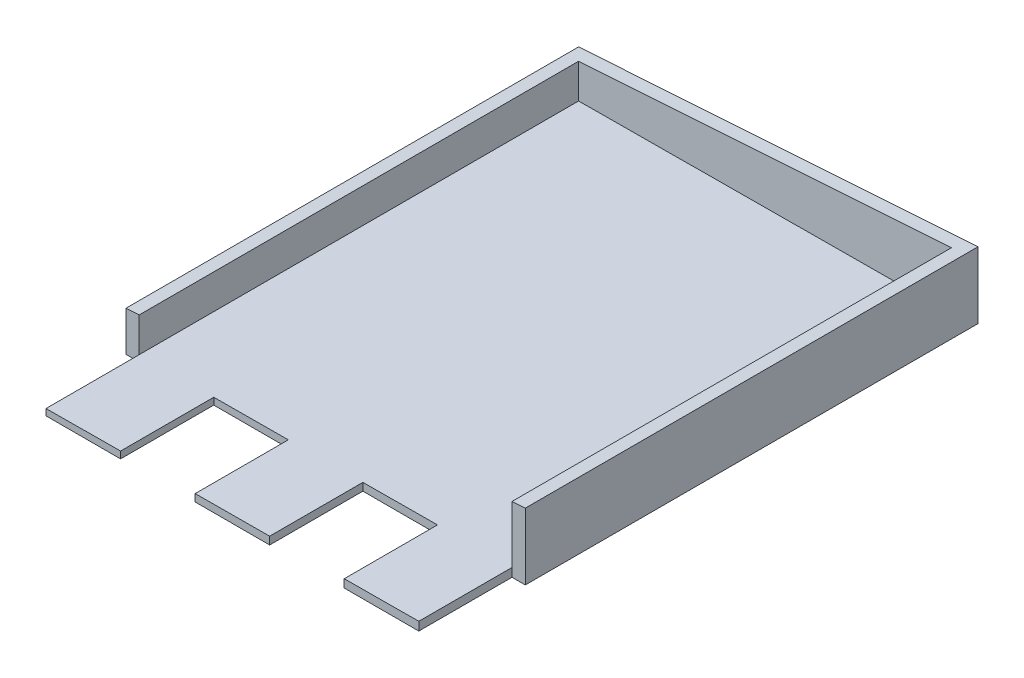
ISO-10303-21;
HEADER;
FILE_DESCRIPTION(('STEP AP214'),'2;1');
FILE_NAME('part.step','',(''),(''),'','','');
FILE_SCHEMA(('AUTOMOTIVE_DESIGN { 1 0 10303 214 1 1 1 1 }'));
ENDSEC;
DATA;
#1=APPLICATION_CONTEXT('core data for automotive mechanical design processes');
#2=APPLICATION_PROTOCOL_DEFINITION('international standard','automotive_design',2000,#1);
#3=PRODUCT_CONTEXT('',#1,'mechanical');
#4=PRODUCT('Part','Part','',(#3));
#5=PRODUCT_RELATED_PRODUCT_CATEGORY('part','',(#4));
#6=PRODUCT_DEFINITION_FORMATION('','',#4);
#7=PRODUCT_DEFINITION_CONTEXT('part definition',#1,'design');
#8=PRODUCT_DEFINITION('design','',#6,#7);
#9=PRODUCT_DEFINITION_SHAPE('','',#8);
#10=(LENGTH_UNIT() NAMED_UNIT(*) SI_UNIT(.MILLI.,.METRE.));
#11=(NAMED_UNIT(*) PLANE_ANGLE_UNIT() SI_UNIT($,.RADIAN.));
#12=(NAMED_UNIT(*) SI_UNIT($,.STERADIAN.) SOLID_ANGLE_UNIT());
#13=UNCERTAINTY_MEASURE_WITH_UNIT(LENGTH_MEASURE(1.E-05),#10,'distance_accuracy_value','');
#14=(GEOMETRIC_REPRESENTATION_CONTEXT(3) GLOBAL_UNCERTAINTY_ASSIGNED_CONTEXT((#13)) GLOBAL_UNIT_ASSIGNED_CONTEXT((#10,
#11,#12)) REPRESENTATION_CONTEXT('',''));
#15=CARTESIAN_POINT('',(0.,0.,0.));
#16=DIRECTION('',(0.,0.,1.));
#17=DIRECTION('',(1.,0.,0.));
#18=AXIS2_PLACEMENT_3D('',#15,#16,#17);
#19=CARTESIAN_POINT('',(0.,0.,170.));
#20=DIRECTION('',(0.,0.,1.));
#21=DIRECTION('',(1.,0.,0.));
#22=AXIS2_PLACEMENT_3D('',#19,#20,#21);
#23=PLANE('',#22);
#24=DIRECTION('',(1.,0.,0.));
#25=VECTOR('',#24,1.);
#26=CARTESIAN_POINT('',(1.57459931571508E-13,-15.,170.));
#27=LINE('',#26,#25);
#28=CARTESIAN_POINT('',(1.57459931571508E-13,-15.,170.));
#29=VERTEX_POINT('',#28);
#30=CARTESIAN_POINT('',(5.,-15.,170.));
#31=VERTEX_POINT('',#30);
#32=EDGE_CURVE('E204',#29,#31,#27,.T.);
#33=ORIENTED_EDGE('',*,*,#32,.T.);
#34=DIRECTION('',(0.,-1.,0.));
#35=VECTOR('',#34,1.);
#36=CARTESIAN_POINT('',(5.,-12.6,170.));
#37=LINE('',#36,#35);
#38=CARTESIAN_POINT('',(5.,-12.6,170.));
#39=VERTEX_POINT('',#38);
#40=EDGE_CURVE('E195',#39,#31,#37,.T.);
#41=ORIENTED_EDGE('',*,*,#40,.F.);
#42=DIRECTION('',(0.,-1.,0.));
#43=VECTOR('',#42,1.);
#44=CARTESIAN_POINT('',(5.,0.333333333333333,170.));
#45=LINE('',#44,#43);
#46=CARTESIAN_POINT('',(5.,0.333333333333333,170.));
#47=VERTEX_POINT('',#46);
#48=EDGE_CURVE('E290',#47,#39,#45,.T.);
#49=ORIENTED_EDGE('',*,*,#48,.F.);
#50=DIRECTION('',(-0.997785157856609,-0.0665190105237739,0.));
#51=VECTOR('',#50,1.);
#52=CARTESIAN_POINT('',(0.,0.,170.));
#53=LINE('',#52,#51);
#54=CARTESIAN_POINT('',(0.,0.,170.));
#55=VERTEX_POINT('',#54);
#56=EDGE_CURVE('E233',#47,#55,#53,.T.);
#57=ORIENTED_EDGE('',*,*,#56,.T.);
#58=DIRECTION('',(0.,-1.,0.));
#59=VECTOR('',#58,1.);
#60=CARTESIAN_POINT('',(0.,0.,170.));
#61=LINE('',#60,#59);
#62=EDGE_CURVE('E214',#55,#29,#61,.T.);
#63=ORIENTED_EDGE('',*,*,#62,.T.);
#64=EDGE_LOOP('',(#33,#41,#49,#57,#63));
#65=FACE_BOUND('',#64,.T.);
#66=ADVANCED_FACE('F43',(#65),#23,.T.);
#67=DIRECTION('',(0.99998367386921,0.00571419242210977,0.));
#68=VECTOR('',#67,1.);
#69=CARTESIAN_POINT('',(5.,-12.6,170.));
#70=LINE('',#69,#68);
#71=CARTESIAN_POINT('',(33.,-12.44,170.));
#72=VERTEX_POINT('',#71);
#73=CARTESIAN_POINT('',(61.,-12.28,170.));
#74=VERTEX_POINT('',#73);
#75=EDGE_CURVE('E193',#72,#74,#70,.T.);
#76=ORIENTED_EDGE('',*,*,#75,.F.);
#77=DIRECTION('',(0.,1.,0.));
#78=VECTOR('',#77,1.);
#79=CARTESIAN_POINT('',(33.,-15.,170.));
#80=LINE('',#79,#78);
#81=CARTESIAN_POINT('',(33.,-15.,170.));
#82=VERTEX_POINT('',#81);
#83=EDGE_CURVE('E179',#82,#72,#80,.T.);
#84=ORIENTED_EDGE('',*,*,#83,.F.);
#85=CARTESIAN_POINT('',(61.,-15.,170.));
#86=VERTEX_POINT('',#85);
#87=EDGE_CURVE('E191',#82,#86,#27,.T.);
#88=ORIENTED_EDGE('',*,*,#87,.T.);
#89=DIRECTION('',(0.,-1.,0.));
#90=VECTOR('',#89,1.);
#91=CARTESIAN_POINT('',(61.,-15.,170.));
#92=LINE('',#91,#90);
#93=EDGE_CURVE('E361',#74,#86,#92,.T.);
#94=ORIENTED_EDGE('',*,*,#93,.F.);
#95=EDGE_LOOP('',(#76,#84,#88,#94));
#96=FACE_BOUND('',#95,.T.);
#97=ADVANCED_FACE('F189',(#96),#23,.T.);
#98=CARTESIAN_POINT('',(89.,-12.12,170.));
#99=VERTEX_POINT('',#98);
#100=CARTESIAN_POINT('',(117.,-11.96,170.));
#101=VERTEX_POINT('',#100);
#102=EDGE_CURVE('E289',#99,#101,#70,.T.);
#103=ORIENTED_EDGE('',*,*,#102,.F.);
#104=DIRECTION('',(0.,1.,0.));
#105=VECTOR('',#104,1.);
#106=CARTESIAN_POINT('',(89.,-12.12,170.));
#107=LINE('',#106,#105);
#108=CARTESIAN_POINT('',(89.,-15.,170.));
#109=VERTEX_POINT('',#108);
#110=EDGE_CURVE('E357',#109,#99,#107,.T.);
#111=ORIENTED_EDGE('',*,*,#110,.F.);
#112=CARTESIAN_POINT('',(117.,-15.,170.));
#113=VERTEX_POINT('',#112);
#114=EDGE_CURVE('E205',#109,#113,#27,.T.);
#115=ORIENTED_EDGE('',*,*,#114,.T.);
#116=DIRECTION('',(0.,-1.,0.));
#117=VECTOR('',#116,1.);
#118=CARTESIAN_POINT('',(117.,-15.,170.));
#119=LINE('',#118,#117);
#120=EDGE_CURVE('E330',#101,#113,#119,.T.);
#121=ORIENTED_EDGE('',*,*,#120,.F.);
#122=EDGE_LOOP('',(#103,#111,#115,#121));
#123=FACE_BOUND('',#122,.T.);
#124=ADVANCED_FACE('F420',(#123),#23,.T.);
#125=DIRECTION('',(0.,1.,0.));
#126=VECTOR('',#125,1.);
#127=CARTESIAN_POINT('',(145.,-11.8,170.));
#128=LINE('',#127,#126);
#129=CARTESIAN_POINT('',(145.,-15.,170.));
#130=VERTEX_POINT('',#129);
#131=CARTESIAN_POINT('',(145.,-11.8,170.));
#132=VERTEX_POINT('',#131);
#133=EDGE_CURVE('E325',#130,#132,#128,.T.);
#134=ORIENTED_EDGE('',*,*,#133,.F.);
#135=CARTESIAN_POINT('',(150.,-15.,170.));
#136=VERTEX_POINT('',#135);
#137=EDGE_CURVE('E211',#130,#136,#27,.T.);
#138=ORIENTED_EDGE('',*,*,#137,.T.);
#139=DIRECTION('',(0.,1.,0.));
#140=VECTOR('',#139,1.);
#141=CARTESIAN_POINT('',(150.,-15.,170.));
#142=LINE('',#141,#140);
#143=CARTESIAN_POINT('',(150.,10.,170.));
#144=VERTEX_POINT('',#143);
#145=EDGE_CURVE('E210',#136,#144,#142,.T.);
#146=ORIENTED_EDGE('',*,*,#145,.T.);
#147=CARTESIAN_POINT('',(145.,9.66666666666666,170.));
#148=VERTEX_POINT('',#147);
#149=EDGE_CURVE('E263',#144,#148,#53,.T.);
#150=ORIENTED_EDGE('',*,*,#149,.T.);
#151=DIRECTION('',(0.,1.,0.));
#152=VECTOR('',#151,1.);
#153=CARTESIAN_POINT('',(145.,-11.8,170.));
#154=LINE('',#153,#152);
#155=EDGE_CURVE('E283',#132,#148,#154,.T.);
#156=ORIENTED_EDGE('',*,*,#155,.F.);
#157=EDGE_LOOP('',(#134,#138,#146,#150,#156));
#158=FACE_BOUND('',#157,.T.);
#159=ADVANCED_FACE('F414',(#158),#23,.T.);
#160=CARTESIAN_POINT('',(0.,0.,170.));
#161=DIRECTION('',(0.0665190105237739,-0.997785157856609,0.));
#162=DIRECTION('',(0.997785157856609,0.0665190105237739,0.));
#163=AXIS2_PLACEMENT_3D('',#160,#161,#162);
#164=PLANE('',#163);
#165=DIRECTION('',(-0.997785157856609,-0.0665190105237739,0.));
#166=VECTOR('',#165,1.);
#167=CARTESIAN_POINT('',(145.,9.66666666666666,5.));
#168=LINE('',#167,#166);
#169=CARTESIAN_POINT('',(145.,9.66666666666666,5.));
#170=VERTEX_POINT('',#169);
#171=CARTESIAN_POINT('',(5.,0.333333333333333,5.));
#172=VERTEX_POINT('',#171);
#173=EDGE_CURVE('E286',#170,#172,#168,.T.);
#174=ORIENTED_EDGE('',*,*,#173,.F.);
#175=DIRECTION('',(0.,0.,1.));
#176=VECTOR('',#175,1.);
#177=CARTESIAN_POINT('',(145.,9.66666666666666,5.));
#178=LINE('',#177,#176);
#179=EDGE_CURVE('E224',#170,#148,#178,.T.);
#180=ORIENTED_EDGE('',*,*,#179,.T.);
#181=ORIENTED_EDGE('',*,*,#149,.F.);
#182=DIRECTION('',(0.,0.,-1.));
#183=VECTOR('',#182,1.);
#184=CARTESIAN_POINT('',(150.,10.,170.));
#185=LINE('',#184,#183);
#186=CARTESIAN_POINT('',(150.,10.,0.));
#187=VERTEX_POINT('',#186);
#188=EDGE_CURVE('E218',#144,#187,#185,.T.);
#189=ORIENTED_EDGE('',*,*,#188,.T.);
#190=DIRECTION('',(-0.997785157856609,-0.0665190105237739,0.));
#191=VECTOR('',#190,1.);
#192=CARTESIAN_POINT('',(0.,0.,0.));
#193=LINE('',#192,#191);
#194=CARTESIAN_POINT('',(0.,0.,0.));
#195=VERTEX_POINT('',#194);
#196=EDGE_CURVE('E219',#187,#195,#193,.T.);
#197=ORIENTED_EDGE('',*,*,#196,.T.);
#198=DIRECTION('',(0.,0.,-1.));
#199=VECTOR('',#198,1.);
#200=CARTESIAN_POINT('',(0.,0.,170.));
#201=LINE('',#200,#199);
#202=EDGE_CURVE('E11',#55,#195,#201,.T.);
#203=ORIENTED_EDGE('',*,*,#202,.F.);
#204=ORIENTED_EDGE('',*,*,#56,.F.);
#205=DIRECTION('',(0.,0.,1.));
#206=VECTOR('',#205,1.);
#207=CARTESIAN_POINT('',(5.,0.333333333333333,5.));
#208=LINE('',#207,#206);
#209=EDGE_CURVE('E270',#172,#47,#208,.T.);
#210=ORIENTED_EDGE('',*,*,#209,.F.);
#211=EDGE_LOOP('',(#174,#180,#181,#189,#197,#203,#204,#210));
#212=FACE_BOUND('',#211,.T.);
#213=ADVANCED_FACE('F45',(#212),#164,.F.);
#214=CARTESIAN_POINT('',(0.,0.,170.));
#215=DIRECTION('',(1.,0.,0.));
#216=DIRECTION('',(0.,1.,0.));
#217=AXIS2_PLACEMENT_3D('',#214,#215,#216);
#218=PLANE('',#217);
#219=DIRECTION('',(0.,-1.,0.));
#220=VECTOR('',#219,1.);
#221=CARTESIAN_POINT('',(0.,0.,0.));
#222=LINE('',#221,#220);
#223=CARTESIAN_POINT('',(1.57459931571508E-13,-15.,0.));
#224=VERTEX_POINT('',#223);
#225=EDGE_CURVE('E223',#195,#224,#222,.T.);
#226=ORIENTED_EDGE('',*,*,#225,.T.);
#227=DIRECTION('',(0.,0.,-1.));
#228=VECTOR('',#227,1.);
#229=CARTESIAN_POINT('',(1.57459931571508E-13,-15.,170.));
#230=LINE('',#229,#228);
#231=EDGE_CURVE('E52',#29,#224,#230,.T.);
#232=ORIENTED_EDGE('',*,*,#231,.F.);
#233=ORIENTED_EDGE('',*,*,#62,.F.);
#234=ORIENTED_EDGE('',*,*,#202,.T.);
#235=EDGE_LOOP('',(#226,#232,#233,#234));
#236=FACE_BOUND('',#235,.T.);
#237=ADVANCED_FACE('F407',(#236),#218,.F.);
#238=CARTESIAN_POINT('',(1.57459931571508E-13,-15.,170.));
#239=DIRECTION('',(0.,1.,0.));
#240=DIRECTION('',(0.,0.,1.));
#241=AXIS2_PLACEMENT_3D('',#238,#239,#240);
#242=PLANE('',#241);
#243=DIRECTION('',(1.,0.,0.));
#244=VECTOR('',#243,1.);
#245=CARTESIAN_POINT('',(1.57459931571508E-13,-15.,0.));
#246=LINE('',#245,#244);
#247=CARTESIAN_POINT('',(150.,-15.,0.));
#248=VERTEX_POINT('',#247);
#249=EDGE_CURVE('E227',#224,#248,#246,.T.);
#250=ORIENTED_EDGE('',*,*,#249,.T.);
#251=DIRECTION('',(0.,0.,-1.));
#252=VECTOR('',#251,1.);
#253=CARTESIAN_POINT('',(150.,-15.,170.));
#254=LINE('',#253,#252);
#255=EDGE_CURVE('E237',#136,#248,#254,.T.);
#256=ORIENTED_EDGE('',*,*,#255,.F.);
#257=ORIENTED_EDGE('',*,*,#137,.F.);
#258=DIRECTION('',(0.,0.,-1.));
#259=VECTOR('',#258,1.);
#260=CARTESIAN_POINT('',(145.,-15.,205.));
#261=LINE('',#260,#259);
#262=CARTESIAN_POINT('',(145.,-15.,205.));
#263=VERTEX_POINT('',#262);
#264=EDGE_CURVE('E316',#263,#130,#261,.T.);
#265=ORIENTED_EDGE('',*,*,#264,.F.);
#266=DIRECTION('',(1.,0.,0.));
#267=VECTOR('',#266,1.);
#268=CARTESIAN_POINT('',(145.,-15.,205.));
#269=LINE('',#268,#267);
#270=CARTESIAN_POINT('',(117.,-15.,205.));
#271=VERTEX_POINT('',#270);
#272=EDGE_CURVE('E337',#271,#263,#269,.T.);
#273=ORIENTED_EDGE('',*,*,#272,.F.);
#274=DIRECTION('',(0.,0.,-1.));
#275=VECTOR('',#274,1.);
#276=CARTESIAN_POINT('',(117.,-15.,205.));
#277=LINE('',#276,#275);
#278=EDGE_CURVE('E312',#271,#113,#277,.T.);
#279=ORIENTED_EDGE('',*,*,#278,.T.);
#280=ORIENTED_EDGE('',*,*,#114,.F.);
#281=DIRECTION('',(0.,0.,-1.));
#282=VECTOR('',#281,1.);
#283=CARTESIAN_POINT('',(89.,-15.,205.));
#284=LINE('',#283,#282);
#285=CARTESIAN_POINT('',(89.,-15.,205.));
#286=VERTEX_POINT('',#285);
#287=EDGE_CURVE('E351',#286,#109,#284,.T.);
#288=ORIENTED_EDGE('',*,*,#287,.F.);
#289=DIRECTION('',(1.,0.,0.));
#290=VECTOR('',#289,1.);
#291=CARTESIAN_POINT('',(89.,-15.,205.));
#292=LINE('',#291,#290);
#293=CARTESIAN_POINT('',(61.,-15.,205.));
#294=VERTEX_POINT('',#293);
#295=EDGE_CURVE('E366',#294,#286,#292,.T.);
#296=ORIENTED_EDGE('',*,*,#295,.F.);
#297=DIRECTION('',(0.,0.,-1.));
#298=VECTOR('',#297,1.);
#299=CARTESIAN_POINT('',(61.,-15.,205.));
#300=LINE('',#299,#298);
#301=EDGE_CURVE('E202',#294,#86,#300,.T.);
#302=ORIENTED_EDGE('',*,*,#301,.T.);
#303=ORIENTED_EDGE('',*,*,#87,.F.);
#304=DIRECTION('',(0.,0.,-1.));
#305=VECTOR('',#304,1.);
#306=CARTESIAN_POINT('',(33.,-15.,205.));
#307=LINE('',#306,#305);
#308=CARTESIAN_POINT('',(33.,-15.,205.));
#309=VERTEX_POINT('',#308);
#310=EDGE_CURVE('E176',#309,#82,#307,.T.);
#311=ORIENTED_EDGE('',*,*,#310,.F.);
#312=DIRECTION('',(1.,0.,0.));
#313=VECTOR('',#312,1.);
#314=CARTESIAN_POINT('',(5.,-15.,205.));
#315=LINE('',#314,#313);
#316=CARTESIAN_POINT('',(5.,-15.,205.));
#317=VERTEX_POINT('',#316);
#318=EDGE_CURVE('E381',#317,#309,#315,.T.);
#319=ORIENTED_EDGE('',*,*,#318,.F.);
#320=DIRECTION('',(0.,0.,-1.));
#321=VECTOR('',#320,1.);
#322=CARTESIAN_POINT('',(5.,-15.,205.));
#323=LINE('',#322,#321);
#324=EDGE_CURVE('E186',#317,#31,#323,.T.);
#325=ORIENTED_EDGE('',*,*,#324,.T.);
#326=ORIENTED_EDGE('',*,*,#32,.F.);
#327=ORIENTED_EDGE('',*,*,#231,.T.);
#328=EDGE_LOOP('',(#250,#256,#257,#265,#273,#279,#280,#288,#296,#302,#303,#311,#319,#325,#326,#327));
#329=FACE_BOUND('',#328,.T.);
#330=ADVANCED_FACE('F199',(#329),#242,.F.);
#331=CARTESIAN_POINT('',(150.,-15.,170.));
#332=DIRECTION('',(-1.,0.,0.));
#333=DIRECTION('',(0.,0.,1.));
#334=AXIS2_PLACEMENT_3D('',#331,#332,#333);
#335=PLANE('',#334);
#336=DIRECTION('',(0.,1.,0.));
#337=VECTOR('',#336,1.);
#338=CARTESIAN_POINT('',(150.,-15.,0.));
#339=LINE('',#338,#337);
#340=EDGE_CURVE('E230',#248,#187,#339,.T.);
#341=ORIENTED_EDGE('',*,*,#340,.T.);
#342=ORIENTED_EDGE('',*,*,#188,.F.);
#343=ORIENTED_EDGE('',*,*,#145,.F.);
#344=ORIENTED_EDGE('',*,*,#255,.T.);
#345=EDGE_LOOP('',(#341,#342,#343,#344));
#346=FACE_BOUND('',#345,.T.);
#347=ADVANCED_FACE('F255',(#346),#335,.F.);
#348=CARTESIAN_POINT('',(0.,0.,0.));
#349=DIRECTION('',(0.,0.,1.));
#350=DIRECTION('',(1.,0.,0.));
#351=AXIS2_PLACEMENT_3D('',#348,#349,#350);
#352=PLANE('',#351);
#353=ORIENTED_EDGE('',*,*,#196,.F.);
#354=ORIENTED_EDGE('',*,*,#340,.F.);
#355=ORIENTED_EDGE('',*,*,#249,.F.);
#356=ORIENTED_EDGE('',*,*,#225,.F.);
#357=EDGE_LOOP('',(#353,#354,#355,#356));
#358=FACE_BOUND('',#357,.T.);
#359=ADVANCED_FACE('F252',(#358),#352,.F.);
#360=CARTESIAN_POINT('',(145.,-11.8,5.));
#361=DIRECTION('',(1.,0.,0.));
#362=DIRECTION('',(0.,0.,-1.));
#363=AXIS2_PLACEMENT_3D('',#360,#361,#362);
#364=PLANE('',#363);
#365=ORIENTED_EDGE('',*,*,#155,.T.);
#366=ORIENTED_EDGE('',*,*,#179,.F.);
#367=DIRECTION('',(0.,1.,0.));
#368=VECTOR('',#367,1.);
#369=CARTESIAN_POINT('',(145.,-11.8,5.));
#370=LINE('',#369,#368);
#371=CARTESIAN_POINT('',(145.,-11.8,5.));
#372=VERTEX_POINT('',#371);
#373=EDGE_CURVE('E274',#372,#170,#370,.T.);
#374=ORIENTED_EDGE('',*,*,#373,.F.);
#375=DIRECTION('',(0.,0.,1.));
#376=VECTOR('',#375,1.);
#377=CARTESIAN_POINT('',(145.,-11.8,5.));
#378=LINE('',#377,#376);
#379=EDGE_CURVE('E278',#372,#132,#378,.T.);
#380=ORIENTED_EDGE('',*,*,#379,.T.);
#381=EDGE_LOOP('',(#365,#366,#374,#380));
#382=FACE_BOUND('',#381,.T.);
#383=ADVANCED_FACE('F474',(#382),#364,.F.);
#384=CARTESIAN_POINT('',(5.,-12.6,5.));
#385=DIRECTION('',(0.00571419242210977,-0.99998367386921,0.));
#386=DIRECTION('',(0.99998367386921,0.00571419242210977,0.));
#387=AXIS2_PLACEMENT_3D('',#384,#385,#386);
#388=PLANE('',#387);
#389=DIRECTION('',(0.,0.,1.));
#390=VECTOR('',#389,1.);
#391=CARTESIAN_POINT('',(5.,-12.6,5.));
#392=LINE('',#391,#390);
#393=CARTESIAN_POINT('',(5.,-12.6,5.));
#394=VERTEX_POINT('',#393);
#395=EDGE_CURVE('E273',#394,#39,#392,.T.);
#396=ORIENTED_EDGE('',*,*,#395,.T.);
#397=DIRECTION('',(0.,0.,-1.));
#398=VECTOR('',#397,1.);
#399=CARTESIAN_POINT('',(5.,-12.6,205.));
#400=LINE('',#399,#398);
#401=CARTESIAN_POINT('',(5.,-12.6,205.));
#402=VERTEX_POINT('',#401);
#403=EDGE_CURVE('E392',#402,#39,#400,.T.);
#404=ORIENTED_EDGE('',*,*,#403,.F.);
#405=DIRECTION('',(-0.99998367386921,-0.00571419242210979,0.));
#406=VECTOR('',#405,1.);
#407=CARTESIAN_POINT('',(33.,-12.44,205.));
#408=LINE('',#407,#406);
#409=CARTESIAN_POINT('',(33.,-12.44,205.));
#410=VERTEX_POINT('',#409);
#411=EDGE_CURVE('E196',#410,#402,#408,.T.);
#412=ORIENTED_EDGE('',*,*,#411,.F.);
#413=DIRECTION('',(0.,0.,-1.));
#414=VECTOR('',#413,1.);
#415=CARTESIAN_POINT('',(33.,-12.44,205.));
#416=LINE('',#415,#414);
#417=EDGE_CURVE('E59',#410,#72,#416,.T.);
#418=ORIENTED_EDGE('',*,*,#417,.T.);
#419=ORIENTED_EDGE('',*,*,#75,.T.);
#420=DIRECTION('',(0.,0.,-1.));
#421=VECTOR('',#420,1.);
#422=CARTESIAN_POINT('',(61.,-12.28,205.));
#423=LINE('',#422,#421);
#424=CARTESIAN_POINT('',(61.,-12.28,205.));
#425=VERTEX_POINT('',#424);
#426=EDGE_CURVE('E334',#425,#74,#423,.T.);
#427=ORIENTED_EDGE('',*,*,#426,.F.);
#428=DIRECTION('',(-0.99998367386921,-0.00571419242210973,0.));
#429=VECTOR('',#428,1.);
#430=CARTESIAN_POINT('',(61.,-12.28,205.));
#431=LINE('',#430,#429);
#432=CARTESIAN_POINT('',(89.,-12.12,205.));
#433=VERTEX_POINT('',#432);
#434=EDGE_CURVE('E360',#433,#425,#431,.T.);
#435=ORIENTED_EDGE('',*,*,#434,.F.);
#436=DIRECTION('',(0.,0.,-1.));
#437=VECTOR('',#436,1.);
#438=CARTESIAN_POINT('',(89.,-12.12,205.));
#439=LINE('',#438,#437);
#440=EDGE_CURVE('E66',#433,#99,#439,.T.);
#441=ORIENTED_EDGE('',*,*,#440,.T.);
#442=ORIENTED_EDGE('',*,*,#102,.T.);
#443=DIRECTION('',(0.,0.,-1.));
#444=VECTOR('',#443,1.);
#445=CARTESIAN_POINT('',(117.,-11.96,205.));
#446=LINE('',#445,#444);
#447=CARTESIAN_POINT('',(117.,-11.96,205.));
#448=VERTEX_POINT('',#447);
#449=EDGE_CURVE('E294',#448,#101,#446,.T.);
#450=ORIENTED_EDGE('',*,*,#449,.F.);
#451=DIRECTION('',(-0.99998367386921,-0.00571419242210979,0.));
#452=VECTOR('',#451,1.);
#453=CARTESIAN_POINT('',(117.,-11.96,205.));
#454=LINE('',#453,#452);
#455=CARTESIAN_POINT('',(145.,-11.8,205.));
#456=VERTEX_POINT('',#455);
#457=EDGE_CURVE('E329',#456,#448,#454,.T.);
#458=ORIENTED_EDGE('',*,*,#457,.F.);
#459=DIRECTION('',(0.,0.,-1.));
#460=VECTOR('',#459,1.);
#461=CARTESIAN_POINT('',(145.,-11.8,205.));
#462=LINE('',#461,#460);
#463=EDGE_CURVE('E320',#456,#132,#462,.T.);
#464=ORIENTED_EDGE('',*,*,#463,.T.);
#465=ORIENTED_EDGE('',*,*,#379,.F.);
#466=DIRECTION('',(0.99998367386921,0.00571419242210977,0.));
#467=VECTOR('',#466,1.);
#468=CARTESIAN_POINT('',(5.,-12.6,5.));
#469=LINE('',#468,#467);
#470=EDGE_CURVE('E298',#394,#372,#469,.T.);
#471=ORIENTED_EDGE('',*,*,#470,.F.);
#472=EDGE_LOOP('',(#396,#404,#412,#418,#419,#427,#435,#441,#442,#450,#458,#464,#465,#471));
#473=FACE_BOUND('',#472,.T.);
#474=ADVANCED_FACE('F403',(#473),#388,.F.);
#475=CARTESIAN_POINT('',(5.,0.333333333333333,5.));
#476=DIRECTION('',(-1.,0.,0.));
#477=DIRECTION('',(0.,-1.,0.));
#478=AXIS2_PLACEMENT_3D('',#475,#476,#477);
#479=PLANE('',#478);
#480=ORIENTED_EDGE('',*,*,#48,.T.);
#481=ORIENTED_EDGE('',*,*,#395,.F.);
#482=DIRECTION('',(0.,-1.,0.));
#483=VECTOR('',#482,1.);
#484=CARTESIAN_POINT('',(5.,0.333333333333333,5.));
#485=LINE('',#484,#483);
#486=EDGE_CURVE('E302',#172,#394,#485,.T.);
#487=ORIENTED_EDGE('',*,*,#486,.F.);
#488=ORIENTED_EDGE('',*,*,#209,.T.);
#489=EDGE_LOOP('',(#480,#481,#487,#488));
#490=FACE_BOUND('',#489,.T.);
#491=ADVANCED_FACE('F405',(#490),#479,.F.);
#492=CARTESIAN_POINT('',(0.,0.,5.));
#493=DIRECTION('',(0.,0.,1.));
#494=DIRECTION('',(1.,0.,0.));
#495=AXIS2_PLACEMENT_3D('',#492,#493,#494);
#496=PLANE('',#495);
#497=ORIENTED_EDGE('',*,*,#173,.T.);
#498=ORIENTED_EDGE('',*,*,#486,.T.);
#499=ORIENTED_EDGE('',*,*,#470,.T.);
#500=ORIENTED_EDGE('',*,*,#373,.T.);
#501=EDGE_LOOP('',(#497,#498,#499,#500));
#502=FACE_BOUND('',#501,.T.);
#503=ADVANCED_FACE('F470',(#502),#496,.T.);
#504=CARTESIAN_POINT('',(117.,-15.,205.));
#505=DIRECTION('',(1.,0.,0.));
#506=DIRECTION('',(0.,0.,-1.));
#507=AXIS2_PLACEMENT_3D('',#504,#505,#506);
#508=PLANE('',#507);
#509=ORIENTED_EDGE('',*,*,#120,.T.);
#510=ORIENTED_EDGE('',*,*,#278,.F.);
#511=DIRECTION('',(0.,-1.,0.));
#512=VECTOR('',#511,1.);
#513=CARTESIAN_POINT('',(117.,-15.,205.));
#514=LINE('',#513,#512);
#515=EDGE_CURVE('E340',#448,#271,#514,.T.);
#516=ORIENTED_EDGE('',*,*,#515,.F.);
#517=ORIENTED_EDGE('',*,*,#449,.T.);
#518=EDGE_LOOP('',(#509,#510,#516,#517));
#519=FACE_BOUND('',#518,.T.);
#520=ADVANCED_FACE('F444',(#519),#508,.F.);
#521=CARTESIAN_POINT('',(145.,-11.8,205.));
#522=DIRECTION('',(-1.,0.,0.));
#523=DIRECTION('',(0.,0.,1.));
#524=AXIS2_PLACEMENT_3D('',#521,#522,#523);
#525=PLANE('',#524);
#526=ORIENTED_EDGE('',*,*,#133,.T.);
#527=ORIENTED_EDGE('',*,*,#463,.F.);
#528=DIRECTION('',(0.,1.,0.));
#529=VECTOR('',#528,1.);
#530=CARTESIAN_POINT('',(145.,-11.8,205.));
#531=LINE('',#530,#529);
#532=EDGE_CURVE('E324',#263,#456,#531,.T.);
#533=ORIENTED_EDGE('',*,*,#532,.F.);
#534=ORIENTED_EDGE('',*,*,#264,.T.);
#535=EDGE_LOOP('',(#526,#527,#533,#534));
#536=FACE_BOUND('',#535,.T.);
#537=ADVANCED_FACE('F435',(#536),#525,.F.);
#538=CARTESIAN_POINT('',(0.,0.,205.));
#539=DIRECTION('',(0.,0.,-1.));
#540=DIRECTION('',(-1.,0.,0.));
#541=AXIS2_PLACEMENT_3D('',#538,#539,#540);
#542=PLANE('',#541);
#543=ORIENTED_EDGE('',*,*,#457,.T.);
#544=ORIENTED_EDGE('',*,*,#515,.T.);
#545=ORIENTED_EDGE('',*,*,#272,.T.);
#546=ORIENTED_EDGE('',*,*,#532,.T.);
#547=EDGE_LOOP('',(#543,#544,#545,#546));
#548=FACE_BOUND('',#547,.T.);
#549=ADVANCED_FACE('F438',(#548),#542,.F.);
#550=CARTESIAN_POINT('',(61.,-15.,205.));
#551=DIRECTION('',(1.,0.,0.));
#552=DIRECTION('',(0.,0.,-1.));
#553=AXIS2_PLACEMENT_3D('',#550,#551,#552);
#554=PLANE('',#553);
#555=ORIENTED_EDGE('',*,*,#93,.T.);
#556=ORIENTED_EDGE('',*,*,#301,.F.);
#557=DIRECTION('',(0.,-1.,0.));
#558=VECTOR('',#557,1.);
#559=CARTESIAN_POINT('',(61.,-15.,205.));
#560=LINE('',#559,#558);
#561=EDGE_CURVE('E369',#425,#294,#560,.T.);
#562=ORIENTED_EDGE('',*,*,#561,.F.);
#563=ORIENTED_EDGE('',*,*,#426,.T.);
#564=EDGE_LOOP('',(#555,#556,#562,#563));
#565=FACE_BOUND('',#564,.T.);
#566=ADVANCED_FACE('F455',(#565),#554,.F.);
#567=CARTESIAN_POINT('',(89.,-12.12,205.));
#568=DIRECTION('',(-1.,0.,0.));
#569=DIRECTION('',(0.,0.,1.));
#570=AXIS2_PLACEMENT_3D('',#567,#568,#569);
#571=PLANE('',#570);
#572=ORIENTED_EDGE('',*,*,#110,.T.);
#573=ORIENTED_EDGE('',*,*,#440,.F.);
#574=DIRECTION('',(0.,1.,0.));
#575=VECTOR('',#574,1.);
#576=CARTESIAN_POINT('',(89.,-12.12,205.));
#577=LINE('',#576,#575);
#578=EDGE_CURVE('E356',#286,#433,#577,.T.);
#579=ORIENTED_EDGE('',*,*,#578,.F.);
#580=ORIENTED_EDGE('',*,*,#287,.T.);
#581=EDGE_LOOP('',(#572,#573,#579,#580));
#582=FACE_BOUND('',#581,.T.);
#583=ADVANCED_FACE('F449',(#582),#571,.F.);
#584=CARTESIAN_POINT('',(0.,0.,205.));
#585=DIRECTION('',(0.,0.,-1.));
#586=DIRECTION('',(-1.,0.,0.));
#587=AXIS2_PLACEMENT_3D('',#584,#585,#586);
#588=PLANE('',#587);
#589=ORIENTED_EDGE('',*,*,#434,.T.);
#590=ORIENTED_EDGE('',*,*,#561,.T.);
#591=ORIENTED_EDGE('',*,*,#295,.T.);
#592=ORIENTED_EDGE('',*,*,#578,.T.);
#593=EDGE_LOOP('',(#589,#590,#591,#592));
#594=FACE_BOUND('',#593,.T.);
#595=ADVANCED_FACE('F452',(#594),#588,.F.);
#596=CARTESIAN_POINT('',(5.,-12.6,205.));
#597=DIRECTION('',(1.,0.,0.));
#598=DIRECTION('',(0.,0.,-1.));
#599=AXIS2_PLACEMENT_3D('',#596,#597,#598);
#600=PLANE('',#599);
#601=ORIENTED_EDGE('',*,*,#40,.T.);
#602=ORIENTED_EDGE('',*,*,#324,.F.);
#603=DIRECTION('',(0.,-1.,0.));
#604=VECTOR('',#603,1.);
#605=CARTESIAN_POINT('',(5.,-12.6,205.));
#606=LINE('',#605,#604);
#607=EDGE_CURVE('E378',#402,#317,#606,.T.);
#608=ORIENTED_EDGE('',*,*,#607,.F.);
#609=ORIENTED_EDGE('',*,*,#403,.T.);
#610=EDGE_LOOP('',(#601,#602,#608,#609));
#611=FACE_BOUND('',#610,.T.);
#612=ADVANCED_FACE('F397',(#611),#600,.F.);
#613=CARTESIAN_POINT('',(33.,-15.,205.));
#614=DIRECTION('',(-1.,0.,0.));
#615=DIRECTION('',(0.,0.,1.));
#616=AXIS2_PLACEMENT_3D('',#613,#614,#615);
#617=PLANE('',#616);
#618=ORIENTED_EDGE('',*,*,#83,.T.);
#619=ORIENTED_EDGE('',*,*,#417,.F.);
#620=DIRECTION('',(0.,1.,0.));
#621=VECTOR('',#620,1.);
#622=CARTESIAN_POINT('',(33.,-15.,205.));
#623=LINE('',#622,#621);
#624=EDGE_CURVE('E181',#309,#410,#623,.T.);
#625=ORIENTED_EDGE('',*,*,#624,.F.);
#626=ORIENTED_EDGE('',*,*,#310,.T.);
#627=EDGE_LOOP('',(#618,#619,#625,#626));
#628=FACE_BOUND('',#627,.T.);
#629=ADVANCED_FACE('F178',(#628),#617,.F.);
#630=CARTESIAN_POINT('',(0.,0.,205.));
#631=DIRECTION('',(0.,0.,1.));
#632=DIRECTION('',(1.,0.,0.));
#633=AXIS2_PLACEMENT_3D('',#630,#631,#632);
#634=PLANE('',#633);
#635=ORIENTED_EDGE('',*,*,#411,.T.);
#636=ORIENTED_EDGE('',*,*,#607,.T.);
#637=ORIENTED_EDGE('',*,*,#318,.T.);
#638=ORIENTED_EDGE('',*,*,#624,.T.);
#639=EDGE_LOOP('',(#635,#636,#637,#638));
#640=FACE_BOUND('',#639,.T.);
#641=ADVANCED_FACE('F578',(#640),#634,.T.);
#642=CLOSED_SHELL('',(#66,#97,#124,#159,#213,#237,#330,#347,#359,#383,#474,#491,#503,#520,#537,
#549,#566,#583,#595,#612,#629,#641));
#643=MANIFOLD_SOLID_BREP('B2',#642);
#644=ADVANCED_BREP_SHAPE_REPRESENTATION('',(#18,#643),#14);
#645=SHAPE_DEFINITION_REPRESENTATION(#9,#644);
ENDSEC;
END-ISO-10303-21;
